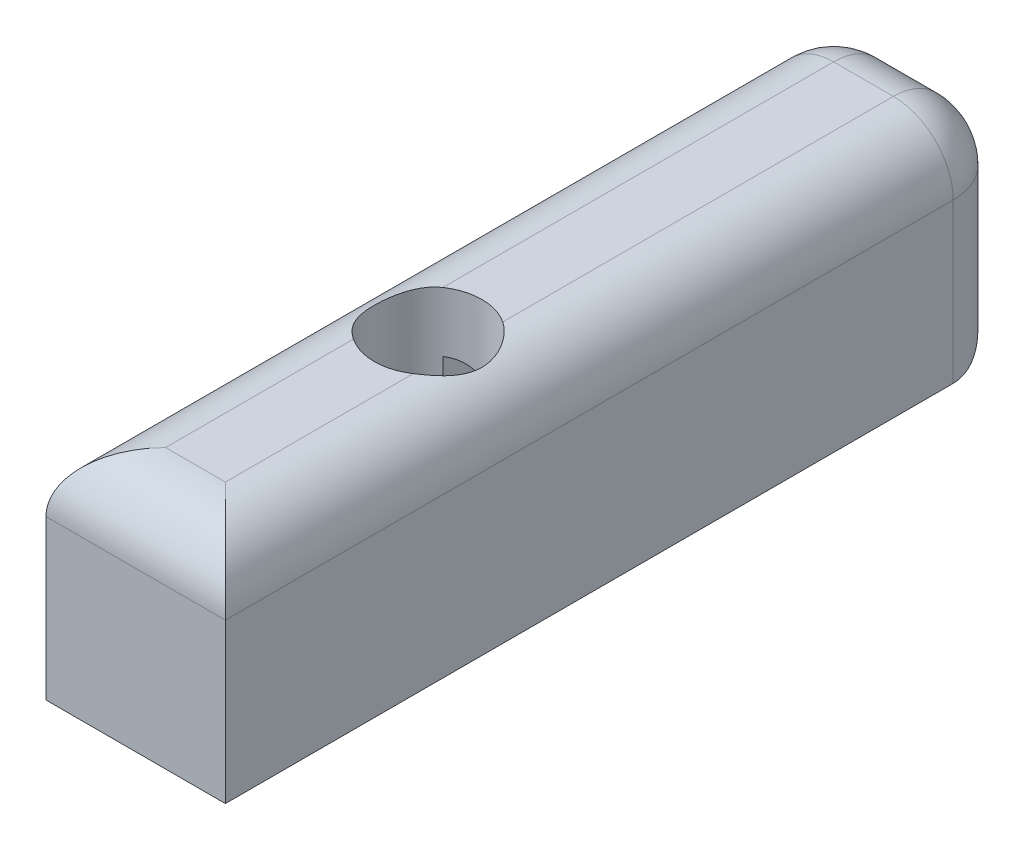
ISO-10303-21;
HEADER;
FILE_DESCRIPTION(('STEP AP214'),'2;1');
FILE_NAME('part.step','',(''),(''),'','','');
FILE_SCHEMA(('AUTOMOTIVE_DESIGN { 1 0 10303 214 1 1 1 1 }'));
ENDSEC;
DATA;
#1=APPLICATION_CONTEXT('core data for automotive mechanical design processes');
#2=APPLICATION_PROTOCOL_DEFINITION('international standard','automotive_design',2000,#1);
#3=PRODUCT_CONTEXT('',#1,'mechanical');
#4=PRODUCT('Part','Part','',(#3));
#5=PRODUCT_RELATED_PRODUCT_CATEGORY('part','',(#4));
#6=PRODUCT_DEFINITION_FORMATION('','',#4);
#7=PRODUCT_DEFINITION_CONTEXT('part definition',#1,'design');
#8=PRODUCT_DEFINITION('design','',#6,#7);
#9=PRODUCT_DEFINITION_SHAPE('','',#8);
#10=(LENGTH_UNIT() NAMED_UNIT(*) SI_UNIT(.MILLI.,.METRE.));
#11=(NAMED_UNIT(*) PLANE_ANGLE_UNIT() SI_UNIT($,.RADIAN.));
#12=(NAMED_UNIT(*) SI_UNIT($,.STERADIAN.) SOLID_ANGLE_UNIT());
#13=UNCERTAINTY_MEASURE_WITH_UNIT(LENGTH_MEASURE(1.E-05),#10,'distance_accuracy_value','');
#14=(GEOMETRIC_REPRESENTATION_CONTEXT(3) GLOBAL_UNCERTAINTY_ASSIGNED_CONTEXT((#13)) GLOBAL_UNIT_ASSIGNED_CONTEXT((#10,
#11,#12)) REPRESENTATION_CONTEXT('',''));
#15=CARTESIAN_POINT('',(0.,0.,0.));
#16=DIRECTION('',(0.,0.,1.));
#17=DIRECTION('',(1.,0.,0.));
#18=AXIS2_PLACEMENT_3D('',#15,#16,#17);
#19=CARTESIAN_POINT('',(30.,25.4386129135543,48.894996249429));
#20=DIRECTION('',(0.,-1.,0.));
#21=DIRECTION('',(0.,0.,-1.));
#22=AXIS2_PLACEMENT_3D('',#19,#20,#21);
#23=PLANE('',#22);
#24=DIRECTION('',(-1.,0.,0.));
#25=VECTOR('',#24,1.);
#26=CARTESIAN_POINT('',(30.,25.4386129135543,38.894996249429));
#27=LINE('',#26,#25);
#28=CARTESIAN_POINT('',(10.,25.4386129135543,38.894996249429));
#29=VERTEX_POINT('',#28);
#30=CARTESIAN_POINT('',(20.,25.4386129135543,38.894996249429));
#31=VERTEX_POINT('',#30);
#32=EDGE_CURVE('E226',#29,#31,#27,.F.);
#33=ORIENTED_EDGE('',*,*,#32,.T.);
#34=DIRECTION('',(0.,0.,1.));
#35=VECTOR('',#34,1.);
#36=CARTESIAN_POINT('',(20.,25.4386129135543,-82.8131468008347));
#37=LINE('',#36,#35);
#38=CARTESIAN_POINT('',(20.,25.4386129135543,7.48331477354788));
#39=VERTEX_POINT('',#38);
#40=EDGE_CURVE('E233',#31,#39,#37,.F.);
#41=ORIENTED_EDGE('',*,*,#40,.T.);
#42=CARTESIAN_POINT('',(15.,25.4386129135543,0.));
#43=DIRECTION('',(0.,1.,0.));
#44=DIRECTION('',(0.,0.,1.));
#45=AXIS2_PLACEMENT_3D('',#42,#43,#44);
#46=CIRCLE('',#45,9.);
#47=CARTESIAN_POINT('',(10.,25.4386129135543,7.48331477354788));
#48=VERTEX_POINT('',#47);
#49=EDGE_CURVE('E299',#48,#39,#46,.T.);
#50=ORIENTED_EDGE('',*,*,#49,.F.);
#51=DIRECTION('',(0.,0.,1.));
#52=VECTOR('',#51,1.);
#53=CARTESIAN_POINT('',(10.,25.4386129135543,48.894996249429));
#54=LINE('',#53,#52);
#55=EDGE_CURVE('E230',#48,#29,#54,.T.);
#56=ORIENTED_EDGE('',*,*,#55,.T.);
#57=EDGE_LOOP('',(#33,#41,#50,#56));
#58=FACE_BOUND('',#57,.T.);
#59=ADVANCED_FACE('F44',(#58),#23,.F.);
#60=CARTESIAN_POINT('',(30.,25.4386129135543,48.894996249429));
#61=DIRECTION('',(0.,0.,-1.));
#62=DIRECTION('',(-1.,0.,0.));
#63=AXIS2_PLACEMENT_3D('',#60,#61,#62);
#64=PLANE('',#63);
#65=DIRECTION('',(0.,-1.,0.));
#66=VECTOR('',#65,1.);
#67=CARTESIAN_POINT('',(30.,25.4386129135543,48.894996249429));
#68=LINE('',#67,#66);
#69=CARTESIAN_POINT('',(30.,15.4386129135543,48.894996249429));
#70=VERTEX_POINT('',#69);
#71=CARTESIAN_POINT('',(30.,-11.1225104080908,48.894996249429));
#72=VERTEX_POINT('',#71);
#73=EDGE_CURVE('E320',#70,#72,#68,.T.);
#74=ORIENTED_EDGE('',*,*,#73,.F.);
#75=DIRECTION('',(-1.,0.,0.));
#76=VECTOR('',#75,1.);
#77=CARTESIAN_POINT('',(30.,15.4386129135543,48.894996249429));
#78=LINE('',#77,#76);
#79=CARTESIAN_POINT('',(0.,15.4386129135543,48.894996249429));
#80=VERTEX_POINT('',#79);
#81=EDGE_CURVE('E419',#70,#80,#78,.T.);
#82=ORIENTED_EDGE('',*,*,#81,.T.);
#83=DIRECTION('',(0.,-1.,0.));
#84=VECTOR('',#83,1.);
#85=CARTESIAN_POINT('',(0.,25.4386129135543,48.894996249429));
#86=LINE('',#85,#84);
#87=CARTESIAN_POINT('',(0.,-11.1225104080908,48.894996249429));
#88=VERTEX_POINT('',#87);
#89=EDGE_CURVE('E316',#80,#88,#86,.T.);
#90=ORIENTED_EDGE('',*,*,#89,.T.);
#91=DIRECTION('',(-1.,0.,0.));
#92=VECTOR('',#91,1.);
#93=CARTESIAN_POINT('',(30.,-11.1225104080908,48.894996249429));
#94=LINE('',#93,#92);
#95=EDGE_CURVE('E215',#72,#88,#94,.T.);
#96=ORIENTED_EDGE('',*,*,#95,.F.);
#97=EDGE_LOOP('',(#74,#82,#90,#96));
#98=FACE_BOUND('',#97,.T.);
#99=ADVANCED_FACE('F375',(#98),#64,.F.);
#100=CARTESIAN_POINT('',(30.,-11.1225104080908,48.894996249429));
#101=DIRECTION('',(0.,1.,0.));
#102=DIRECTION('',(0.,0.,1.));
#103=AXIS2_PLACEMENT_3D('',#100,#101,#102);
#104=PLANE('',#103);
#105=CARTESIAN_POINT('',(15.,-11.1225104080908,0.));
#106=DIRECTION('',(0.,1.,0.));
#107=DIRECTION('',(0.,0.,1.));
#108=AXIS2_PLACEMENT_3D('',#105,#106,#107);
#109=CIRCLE('',#108,9.);
#110=CARTESIAN_POINT('',(15.,-11.1225104080908,9.));
#111=VERTEX_POINT('',#110);
#112=EDGE_CURVE('E310',#111,#111,#109,.T.);
#113=ORIENTED_EDGE('',*,*,#112,.T.);
#114=EDGE_LOOP('',(#113));
#115=FACE_BOUND('',#114,.T.);
#116=DIRECTION('',(0.,0.,-1.));
#117=VECTOR('',#116,1.);
#118=CARTESIAN_POINT('',(0.,-11.1225104080908,48.894996249429));
#119=LINE('',#118,#117);
#120=CARTESIAN_POINT('',(0.,-11.1225104080908,-72.8131468008347));
#121=VERTEX_POINT('',#120);
#122=EDGE_CURVE('E319',#88,#121,#119,.T.);
#123=ORIENTED_EDGE('',*,*,#122,.T.);
#124=DIRECTION('',(-1.,0.,0.));
#125=VECTOR('',#124,1.);
#126=CARTESIAN_POINT('',(30.,-11.1225104080908,-72.8131468008347));
#127=LINE('',#126,#125);
#128=CARTESIAN_POINT('',(30.,-11.1225104080908,-72.8131468008347));
#129=VERTEX_POINT('',#128);
#130=EDGE_CURVE('E427',#121,#129,#127,.F.);
#131=ORIENTED_EDGE('',*,*,#130,.T.);
#132=DIRECTION('',(0.,0.,-1.));
#133=VECTOR('',#132,1.);
#134=CARTESIAN_POINT('',(30.,-11.1225104080908,48.894996249429));
#135=LINE('',#134,#133);
#136=EDGE_CURVE('E317',#72,#129,#135,.T.);
#137=ORIENTED_EDGE('',*,*,#136,.F.);
#138=ORIENTED_EDGE('',*,*,#95,.T.);
#139=EDGE_LOOP('',(#123,#131,#137,#138));
#140=FACE_BOUND('',#139,.T.);
#141=ADVANCED_FACE('F379',(#115,#140),#104,.F.);
#142=CARTESIAN_POINT('',(30.,25.4386129135543,-82.8131468008347));
#143=DIRECTION('',(0.,0.,1.));
#144=DIRECTION('',(1.,0.,0.));
#145=AXIS2_PLACEMENT_3D('',#142,#143,#144);
#146=PLANE('',#145);
#147=DIRECTION('',(0.,1.,0.));
#148=VECTOR('',#147,1.);
#149=CARTESIAN_POINT('',(20.,-11.1225104080908,-82.8131468008347));
#150=LINE('',#149,#148);
#151=CARTESIAN_POINT('',(20.,15.4386129135543,-82.8131468008347));
#152=VERTEX_POINT('',#151);
#153=CARTESIAN_POINT('',(20.,-1.12251040809084,-82.8131468008347));
#154=VERTEX_POINT('',#153);
#155=EDGE_CURVE('E72',#152,#154,#150,.F.);
#156=ORIENTED_EDGE('',*,*,#155,.T.);
#157=DIRECTION('',(-1.,0.,0.));
#158=VECTOR('',#157,1.);
#159=CARTESIAN_POINT('',(30.,-1.12251040809084,-82.8131468008347));
#160=LINE('',#159,#158);
#161=CARTESIAN_POINT('',(10.,-1.12251040809084,-82.8131468008347));
#162=VERTEX_POINT('',#161);
#163=EDGE_CURVE('E435',#154,#162,#160,.T.);
#164=ORIENTED_EDGE('',*,*,#163,.T.);
#165=DIRECTION('',(0.,1.,0.));
#166=VECTOR('',#165,1.);
#167=CARTESIAN_POINT('',(10.,25.4386129135543,-82.8131468008347));
#168=LINE('',#167,#166);
#169=CARTESIAN_POINT('',(10.,15.4386129135543,-82.8131468008347));
#170=VERTEX_POINT('',#169);
#171=EDGE_CURVE('E440',#162,#170,#168,.T.);
#172=ORIENTED_EDGE('',*,*,#171,.T.);
#173=DIRECTION('',(-1.,0.,0.));
#174=VECTOR('',#173,1.);
#175=CARTESIAN_POINT('',(30.,15.4386129135543,-82.8131468008347));
#176=LINE('',#175,#174);
#177=EDGE_CURVE('E406',#170,#152,#176,.F.);
#178=ORIENTED_EDGE('',*,*,#177,.T.);
#179=EDGE_LOOP('',(#156,#164,#172,#178));
#180=FACE_BOUND('',#179,.T.);
#181=ADVANCED_FACE('F384',(#180),#146,.F.);
#182=CARTESIAN_POINT('',(20.,25.4386129135543,-7.48331477354788));
#183=VERTEX_POINT('',#182);
#184=CARTESIAN_POINT('',(10.,25.4386129135543,-7.48331477354788));
#185=VERTEX_POINT('',#184);
#186=EDGE_CURVE('E302',#183,#185,#46,.T.);
#187=ORIENTED_EDGE('',*,*,#186,.F.);
#188=DIRECTION('',(0.,0.,1.));
#189=VECTOR('',#188,1.);
#190=CARTESIAN_POINT('',(20.,25.4386129135543,-82.8131468008347));
#191=LINE('',#190,#189);
#192=CARTESIAN_POINT('',(20.,25.4386129135543,-72.8131468008347));
#193=VERTEX_POINT('',#192);
#194=EDGE_CURVE('E223',#183,#193,#191,.F.);
#195=ORIENTED_EDGE('',*,*,#194,.T.);
#196=DIRECTION('',(-1.,0.,0.));
#197=VECTOR('',#196,1.);
#198=CARTESIAN_POINT('',(30.,25.4386129135543,-72.8131468008347));
#199=LINE('',#198,#197);
#200=CARTESIAN_POINT('',(10.,25.4386129135543,-72.8131468008347));
#201=VERTEX_POINT('',#200);
#202=EDGE_CURVE('E222',#193,#201,#199,.T.);
#203=ORIENTED_EDGE('',*,*,#202,.T.);
#204=DIRECTION('',(0.,0.,1.));
#205=VECTOR('',#204,1.);
#206=CARTESIAN_POINT('',(10.,25.4386129135543,48.894996249429));
#207=LINE('',#206,#205);
#208=EDGE_CURVE('E224',#201,#185,#207,.T.);
#209=ORIENTED_EDGE('',*,*,#208,.T.);
#210=EDGE_LOOP('',(#187,#195,#203,#209));
#211=FACE_BOUND('',#210,.T.);
#212=ADVANCED_FACE('F374',(#211),#23,.F.);
#213=CARTESIAN_POINT('',(30.,0.,0.));
#214=DIRECTION('',(1.,0.,0.));
#215=DIRECTION('',(0.,0.,-1.));
#216=AXIS2_PLACEMENT_3D('',#213,#214,#215);
#217=PLANE('',#216);
#218=DIRECTION('',(0.,1.,0.));
#219=VECTOR('',#218,1.);
#220=CARTESIAN_POINT('',(30.,25.4386129135543,-72.8131468008347));
#221=LINE('',#220,#219);
#222=CARTESIAN_POINT('',(30.,15.4386129135543,-72.8131468008347));
#223=VERTEX_POINT('',#222);
#224=EDGE_CURVE('E216',#129,#223,#221,.T.);
#225=ORIENTED_EDGE('',*,*,#224,.T.);
#226=DIRECTION('',(0.,0.,1.));
#227=VECTOR('',#226,1.);
#228=CARTESIAN_POINT('',(30.,15.4386129135543,48.894996249429));
#229=LINE('',#228,#227);
#230=EDGE_CURVE('E217',#223,#70,#229,.T.);
#231=ORIENTED_EDGE('',*,*,#230,.T.);
#232=ORIENTED_EDGE('',*,*,#73,.T.);
#233=ORIENTED_EDGE('',*,*,#136,.T.);
#234=EDGE_LOOP('',(#225,#231,#232,#233));
#235=FACE_BOUND('',#234,.T.);
#236=ADVANCED_FACE('F259',(#235),#217,.T.);
#237=CARTESIAN_POINT('',(0.,0.,0.));
#238=DIRECTION('',(1.,0.,0.));
#239=DIRECTION('',(0.,0.,-1.));
#240=AXIS2_PLACEMENT_3D('',#237,#238,#239);
#241=PLANE('',#240);
#242=ORIENTED_EDGE('',*,*,#89,.F.);
#243=DIRECTION('',(0.,0.,1.));
#244=VECTOR('',#243,1.);
#245=CARTESIAN_POINT('',(0.,15.4386129135543,0.));
#246=LINE('',#245,#244);
#247=CARTESIAN_POINT('',(0.,15.4386129135543,-72.8131468008347));
#248=VERTEX_POINT('',#247);
#249=EDGE_CURVE('E445',#80,#248,#246,.F.);
#250=ORIENTED_EDGE('',*,*,#249,.T.);
#251=DIRECTION('',(0.,1.,0.));
#252=VECTOR('',#251,1.);
#253=CARTESIAN_POINT('',(0.,0.,-72.8131468008347));
#254=LINE('',#253,#252);
#255=EDGE_CURVE('E421',#248,#121,#254,.F.);
#256=ORIENTED_EDGE('',*,*,#255,.T.);
#257=ORIENTED_EDGE('',*,*,#122,.F.);
#258=EDGE_LOOP('',(#242,#250,#256,#257));
#259=FACE_BOUND('',#258,.T.);
#260=ADVANCED_FACE('F260',(#259),#241,.F.);
#261=CARTESIAN_POINT('',(15.,-11.1225104080908,0.));
#262=DIRECTION('',(0.,1.,0.));
#263=DIRECTION('',(0.,0.,1.));
#264=AXIS2_PLACEMENT_3D('',#261,#262,#263);
#265=CYLINDRICAL_SURFACE('',#264,9.);
#266=ORIENTED_EDGE('',*,*,#112,.F.);
#267=EDGE_LOOP('',(#266));
#268=FACE_BOUND('',#267,.T.);
#269=ORIENTED_EDGE('',*,*,#49,.T.);
#270=CARTESIAN_POINT('',(20.,25.4386129135543,7.48331477354788));
#271=CARTESIAN_POINT('',(20.2044202657926,25.4386318747185,7.34677883935248));
#272=CARTESIAN_POINT('',(20.4031040774354,25.4323465664144,7.20186948554862));
#273=CARTESIAN_POINT('',(20.787440201232,25.4094129293221,6.8967729737463));
#274=CARTESIAN_POINT('',(20.9731050794621,25.3927747508596,6.73660090996209));
#275=CARTESIAN_POINT('',(21.3296693798486,25.3514395217409,6.40271949756168));
#276=CARTESIAN_POINT('',(21.5006148716042,25.3267688640338,6.22905588312508));
#277=CARTESIAN_POINT('',(21.8274955870689,25.2716050225402,5.86893864486899));
#278=CARTESIAN_POINT('',(21.9834271596409,25.2411104278205,5.68248192876342));
#279=CARTESIAN_POINT('',(22.2789667712618,25.176637351475,5.29859815920714));
#280=CARTESIAN_POINT('',(22.4186252437168,25.142670281313,5.10120795737468));
#281=CARTESIAN_POINT('',(22.6815229255829,25.0733375305751,4.6960123251975));
#282=CARTESIAN_POINT('',(22.8047617199581,25.0379718146753,4.4882066317658));
#283=CARTESIAN_POINT('',(23.0343193571445,24.9679009119605,4.06302197622977));
#284=CARTESIAN_POINT('',(23.1406184005511,24.9331965392249,3.8456321853594));
#285=CARTESIAN_POINT('',(23.3354560137158,24.8665148587863,3.40274500600064));
#286=CARTESIAN_POINT('',(23.4240026012248,24.8345363237494,3.1772513320764));
#287=CARTESIAN_POINT('',(23.5872046815364,24.7734929108084,2.70654061415739));
#288=CARTESIAN_POINT('',(23.6608119198475,24.7446894836994,2.4609245261719));
#289=CARTESIAN_POINT('',(23.7869250421873,24.6940883838402,1.96360651152121));
#290=CARTESIAN_POINT('',(23.8394304945266,24.6722908544148,1.71190446046422));
#291=CARTESIAN_POINT('',(23.9227225747835,24.6372158872383,1.20458631067314));
#292=CARTESIAN_POINT('',(23.9535304410565,24.6239301190321,0.9489742903241));
#293=CARTESIAN_POINT('',(23.9931282162408,24.6067862810459,0.435743385142729));
#294=CARTESIAN_POINT('',(24.0019199903198,24.6029274126349,0.178124672169171));
#295=CARTESIAN_POINT('',(23.9975453245965,24.6048346119382,-0.318115708161611));
#296=CARTESIAN_POINT('',(23.9859304483414,24.6099206107542,-0.556755379971042));
#297=CARTESIAN_POINT('',(23.9438136384441,24.6281101748992,-1.03204195848955));
#298=CARTESIAN_POINT('',(23.9133124911049,24.6412134064418,-1.26868894774541));
#299=CARTESIAN_POINT('',(23.8337187446949,24.6746541011792,-1.73844961652762));
#300=CARTESIAN_POINT('',(23.7846150085864,24.6949958975298,-1.97156109228502));
#301=CARTESIAN_POINT('',(23.6682768413854,24.7417127638449,-2.43259218316828));
#302=CARTESIAN_POINT('',(23.6010417686271,24.7680880473288,-2.66051161423864));
#303=CARTESIAN_POINT('',(23.449251872875,24.8252634393159,-3.10901933659943));
#304=CARTESIAN_POINT('',(23.364758635888,24.8560477007177,-3.32963054103472));
#305=CARTESIAN_POINT('',(23.1788747957965,24.9204072513608,-3.7631963198589));
#306=CARTESIAN_POINT('',(23.0774834297285,24.9539826665904,-3.97615054800141));
#307=CARTESIAN_POINT('',(22.8584413835322,25.022059789564,-4.39321623606131));
#308=CARTESIAN_POINT('',(22.7407997132875,25.0565609755374,-4.59733251432194));
#309=CARTESIAN_POINT('',(22.4897858014023,25.1245757292883,-4.99585594840936));
#310=CARTESIAN_POINT('',(22.3564117471173,25.1580891827047,-5.19026198176651));
#311=CARTESIAN_POINT('',(22.0636249812448,25.2246076591115,-5.58298600291862));
#312=CARTESIAN_POINT('',(21.9029956110192,25.2573722638524,-5.7804407815538));
#313=CARTESIAN_POINT('',(21.5651193718358,25.3168629423484,-6.1614970346938));
#314=CARTESIAN_POINT('',(21.3878759016209,25.3435902473543,-6.34510132877934));
#315=CARTESIAN_POINT('',(21.0171302832242,25.3885076635957,-6.69774429747021));
#316=CARTESIAN_POINT('',(20.8235727693653,25.4066672001396,-6.86672907603768));
#317=CARTESIAN_POINT('',(20.5225457740762,25.4254582725653,-7.10760510893026));
#318=CARTESIAN_POINT('',(20.4203540965996,25.4303143149011,-7.18584210792421));
#319=CARTESIAN_POINT('',(20.2126287363944,25.4368923209694,-7.3379203548175));
#320=CARTESIAN_POINT('',(20.1070945081115,25.4386137703796,-7.41176087942351));
#321=CARTESIAN_POINT('',(20.,25.4386129135543,-7.48331477354788));
#322=B_SPLINE_CURVE_WITH_KNOTS('',3,(#270,#271,#272,#273,#274,#275,#276,#277,#278,#279,#280,
#281,#282,#283,#284,#285,#286,#287,#288,#289,#290,#291,#292,#293,#294,#295,#296,#297,#298,#299,
#300,#301,#302,#303,#304,#305,#306,#307,#308,#309,#310,#311,#312,#313,#314,#315,#316,#317,#318,
#319,#320,#321),.UNSPECIFIED.,.F.,.F.,(4,2,2,2,2,2,2,2,2,2,2,2,2,2,2,2,2,2,2,2,2,2,2,2,2,4),(0.,
0.737014834996572,1.47330821028985,2.20720629951156,2.94128241223595,3.67301930705886,
4.40477469429356,5.13737919126581,5.86965206434414,6.64270654416793,7.41577683793051,
8.18808936780906,8.96033646640454,9.6763788931482,10.3923915104861,11.1088334709506,
11.8253007895423,12.53925470358,13.2532408619188,13.9668327320774,14.6805069009033,
15.4494563585372,16.2182488542303,16.98976446903,17.3760078228971,17.76231454565),.UNSPECIFIED.);
#323=EDGE_CURVE('E245',#39,#183,#322,.T.);
#324=ORIENTED_EDGE('',*,*,#323,.T.);
#325=ORIENTED_EDGE('',*,*,#186,.T.);
#326=CARTESIAN_POINT('',(10.,25.4386129135543,-7.48331477354788));
#327=CARTESIAN_POINT('',(9.79557973420741,25.4386318747185,-7.34677883935248));
#328=CARTESIAN_POINT('',(9.59689592256461,25.4323465664144,-7.20186948554863));
#329=CARTESIAN_POINT('',(9.21255979876804,25.4094129293221,-6.8967729737463));
#330=CARTESIAN_POINT('',(9.02689492053788,25.3927747508596,-6.73660090996209));
#331=CARTESIAN_POINT('',(8.67033062015141,25.3514395217409,-6.40271949756168));
#332=CARTESIAN_POINT('',(8.4993851283958,25.3267688640338,-6.22905588312508));
#333=CARTESIAN_POINT('',(8.17250441293108,25.2716050225402,-5.86893864486899));
#334=CARTESIAN_POINT('',(8.01657284035906,25.2411104278205,-5.68248192876342));
#335=CARTESIAN_POINT('',(7.72103322873821,25.176637351475,-5.29859815920713));
#336=CARTESIAN_POINT('',(7.58137475628317,25.142670281313,-5.10120795737468));
#337=CARTESIAN_POINT('',(7.31847707441709,25.0733375305751,-4.69601232519749));
#338=CARTESIAN_POINT('',(7.19523828004191,25.0379718146753,-4.48820663176579));
#339=CARTESIAN_POINT('',(6.96568064285553,24.9679009119605,-4.06302197622977));
#340=CARTESIAN_POINT('',(6.85938159944887,24.9331965392249,-3.8456321853594));
#341=CARTESIAN_POINT('',(6.66454398628421,24.8665148587863,-3.40274500600063));
#342=CARTESIAN_POINT('',(6.57599739877523,24.8345363237493,-3.1772513320764));
#343=CARTESIAN_POINT('',(6.41279531846358,24.7734929108084,-2.70654061415739));
#344=CARTESIAN_POINT('',(6.33918808015246,24.7446894836994,-2.4609245261719));
#345=CARTESIAN_POINT('',(6.21307495781272,24.6940883838402,-1.9636065115212));
#346=CARTESIAN_POINT('',(6.16056950547339,24.6722908544148,-1.71190446046421));
#347=CARTESIAN_POINT('',(6.07727742521655,24.6372158872383,-1.20458631067314));
#348=CARTESIAN_POINT('',(6.04646955894347,24.6239301190321,-0.948974290324098));
#349=CARTESIAN_POINT('',(6.00687178375918,24.6067862810459,-0.435743385142727));
#350=CARTESIAN_POINT('',(5.99808000968022,24.6029274126349,-0.178124672169169));
#351=CARTESIAN_POINT('',(6.0024546754035,24.6048346119382,0.318115708161613));
#352=CARTESIAN_POINT('',(6.01406955165858,24.6099206107542,0.556755379971045));
#353=CARTESIAN_POINT('',(6.05618636155593,24.6281101748992,1.03204195848955));
#354=CARTESIAN_POINT('',(6.08668750889512,24.6412134064418,1.26868894774541));
#355=CARTESIAN_POINT('',(6.16628125530507,24.6746541011792,1.73844961652762));
#356=CARTESIAN_POINT('',(6.21538499141361,24.6949958975298,1.97156109228502));
#357=CARTESIAN_POINT('',(6.33172315861456,24.7417127638449,2.43259218316829));
#358=CARTESIAN_POINT('',(6.3989582313729,24.7680880473288,2.66051161423865));
#359=CARTESIAN_POINT('',(6.55074812712497,24.8252634393159,3.10901933659943));
#360=CARTESIAN_POINT('',(6.63524136411199,24.8560477007177,3.32963054103472));
#361=CARTESIAN_POINT('',(6.82112520420353,24.9204072513608,3.7631963198589));
#362=CARTESIAN_POINT('',(6.92251657027147,24.9539826665904,3.97615054800141));
#363=CARTESIAN_POINT('',(7.14155861646785,25.022059789564,4.39321623606131));
#364=CARTESIAN_POINT('',(7.25920028671254,25.0565609755374,4.59733251432194));
#365=CARTESIAN_POINT('',(7.51021419859766,25.1245757292883,4.99585594840936));
#366=CARTESIAN_POINT('',(7.64358825288271,25.1580891827047,5.19026198176651));
#367=CARTESIAN_POINT('',(7.93637501875517,25.2246076591115,5.58298600291863));
#368=CARTESIAN_POINT('',(8.09700438898083,25.2573722638524,5.78044078155381));
#369=CARTESIAN_POINT('',(8.43488062816418,25.3168629423484,6.1614970346938));
#370=CARTESIAN_POINT('',(8.61212409837911,25.3435902473543,6.34510132877934));
#371=CARTESIAN_POINT('',(8.9828697167758,25.3885076635957,6.69774429747022));
#372=CARTESIAN_POINT('',(9.17642723063473,25.4066672001396,6.86672907603768));
#373=CARTESIAN_POINT('',(9.47745422592384,25.4254582725653,7.10760510893026));
#374=CARTESIAN_POINT('',(9.5796459034004,25.4303143149011,7.18584210792421));
#375=CARTESIAN_POINT('',(9.78737126360561,25.4368923209694,7.33792035481751));
#376=CARTESIAN_POINT('',(9.89290549188852,25.4386137703796,7.41176087942351));
#377=CARTESIAN_POINT('',(10.,25.4386129135543,7.48331477354788));
#378=B_SPLINE_CURVE_WITH_KNOTS('',3,(#326,#327,#328,#329,#330,#331,#332,#333,#334,#335,#336,
#337,#338,#339,#340,#341,#342,#343,#344,#345,#346,#347,#348,#349,#350,#351,#352,#353,#354,#355,
#356,#357,#358,#359,#360,#361,#362,#363,#364,#365,#366,#367,#368,#369,#370,#371,#372,#373,#374,
#375,#376,#377),.UNSPECIFIED.,.F.,.F.,(4,2,2,2,2,2,2,2,2,2,2,2,2,2,2,2,2,2,2,2,2,2,2,2,2,4),(0.,
0.73701483499657,1.47330821028985,2.20720629951156,2.94128241223595,3.67301930705887,
4.40477469429357,5.13737919126581,5.86965206434414,6.64270654416794,7.41577683793051,
8.18808936780906,8.96033646640454,9.67637889314821,10.3923915104861,11.1088334709506,
11.8253007895423,12.53925470358,13.2532408619188,13.9668327320774,14.6805069009033,
15.4494563585372,16.2182488542303,16.98976446903,17.3760078228972,17.76231454565),.UNSPECIFIED.);
#379=EDGE_CURVE('E232',#185,#48,#378,.T.);
#380=ORIENTED_EDGE('',*,*,#379,.T.);
#381=EDGE_LOOP('',(#269,#324,#325,#380));
#382=FACE_BOUND('',#381,.T.);
#383=CARTESIAN_POINT('',(15.,15.4386129135543,0.));
#384=DIRECTION('',(0.,-1.,0.));
#385=DIRECTION('',(0.,0.,-1.));
#386=AXIS2_PLACEMENT_3D('',#383,#384,#385);
#387=CIRCLE('',#386,9.);
#388=CARTESIAN_POINT('',(20.,15.4386129135543,7.48331477354788));
#389=VERTEX_POINT('',#388);
#390=CARTESIAN_POINT('',(10.,15.4386129135543,7.48331477354788));
#391=VERTEX_POINT('',#390);
#392=EDGE_CURVE('E182',#389,#391,#387,.T.);
#393=ORIENTED_EDGE('',*,*,#392,.T.);
#394=DIRECTION('',(0.,1.,0.));
#395=VECTOR('',#394,1.);
#396=CARTESIAN_POINT('',(10.,-11.1225104080908,7.48331477354788));
#397=LINE('',#396,#395);
#398=CARTESIAN_POINT('',(10.,-1.12251040809084,7.48331477354788));
#399=VERTEX_POINT('',#398);
#400=EDGE_CURVE('E171',#391,#399,#397,.F.);
#401=ORIENTED_EDGE('',*,*,#400,.T.);
#402=CARTESIAN_POINT('',(15.,-1.12251040809084,0.));
#403=DIRECTION('',(0.,1.,0.));
#404=DIRECTION('',(0.,0.,1.));
#405=AXIS2_PLACEMENT_3D('',#402,#403,#404);
#406=CIRCLE('',#405,9.);
#407=CARTESIAN_POINT('',(20.,-1.12251040809084,7.48331477354788));
#408=VERTEX_POINT('',#407);
#409=EDGE_CURVE('E176',#399,#408,#406,.T.);
#410=ORIENTED_EDGE('',*,*,#409,.T.);
#411=DIRECTION('',(0.,1.,0.));
#412=VECTOR('',#411,1.);
#413=CARTESIAN_POINT('',(20.,-11.1225104080908,7.48331477354788));
#414=LINE('',#413,#412);
#415=EDGE_CURVE('E194',#389,#408,#414,.F.);
#416=ORIENTED_EDGE('',*,*,#415,.F.);
#417=EDGE_LOOP('',(#393,#401,#410,#416));
#418=FACE_BOUND('',#417,.T.);
#419=CARTESIAN_POINT('',(20.,-1.12251040809084,-7.48331477354788));
#420=VERTEX_POINT('',#419);
#421=CARTESIAN_POINT('',(10.,-1.12251040809084,-7.48331477354788));
#422=VERTEX_POINT('',#421);
#423=EDGE_CURVE('E197',#420,#422,#406,.T.);
#424=ORIENTED_EDGE('',*,*,#423,.T.);
#425=DIRECTION('',(0.,1.,0.));
#426=VECTOR('',#425,1.);
#427=CARTESIAN_POINT('',(10.,-11.1225104080908,-7.48331477354788));
#428=LINE('',#427,#426);
#429=CARTESIAN_POINT('',(10.,15.4386129135543,-7.48331477354788));
#430=VERTEX_POINT('',#429);
#431=EDGE_CURVE('E183',#422,#430,#428,.T.);
#432=ORIENTED_EDGE('',*,*,#431,.T.);
#433=CARTESIAN_POINT('',(10.,15.4386129135543,-7.48331477354788));
#434=CARTESIAN_POINT('',(10.1668680470809,15.4386383633604,-7.59485075621062));
#435=CARTESIAN_POINT('',(10.3375410762611,15.4344367779717,-7.70077039929592));
#436=CARTESIAN_POINT('',(10.6852644097764,15.416618647847,-7.90083139449961));
#437=CARTESIAN_POINT('',(10.8623171770635,15.4029984292417,-7.994968133604));
#438=CARTESIAN_POINT('',(11.2211561261529,15.3654098412012,-8.17069315925819));
#439=CARTESIAN_POINT('',(11.4029345289224,15.3414575773045,-8.25230070888685));
#440=CARTESIAN_POINT('',(11.7699224574661,15.2824889536875,-8.40273211239879));
#441=CARTESIAN_POINT('',(11.9551313757416,15.2474745356232,-8.47155820635042));
#442=CARTESIAN_POINT('',(12.3279025408485,15.1657596034757,-8.59643227704676));
#443=CARTESIAN_POINT('',(12.5154700729136,15.1190253305774,-8.65244243065406));
#444=CARTESIAN_POINT('',(12.8907053485434,15.0136741939621,-8.7514874629668));
#445=CARTESIAN_POINT('',(13.0783730978165,14.9550565600708,-8.79452150022521));
#446=CARTESIAN_POINT('',(13.4519480157953,14.8260023749588,-8.86790552549233));
#447=CARTESIAN_POINT('',(13.6378563878848,14.7555746285094,-8.89826490440615));
#448=CARTESIAN_POINT('',(14.006450073745,14.6031170149429,-8.94692234465192));
#449=CARTESIAN_POINT('',(14.1891354447435,14.5210873540642,-8.9652206203521));
#450=CARTESIAN_POINT('',(14.5460775308276,14.3476940357725,-8.99028905739637));
#451=CARTESIAN_POINT('',(14.72043062285,14.2565615626322,-8.99729239311702));
#452=CARTESIAN_POINT('',(15.063588970716,14.0640859643661,-9.00141179557688));
#453=CARTESIAN_POINT('',(15.2323922846573,13.9627393146184,-8.998524437903));
#454=CARTESIAN_POINT('',(15.5634824803911,13.7504328198058,-8.98387204762085));
#455=CARTESIAN_POINT('',(15.7257676950667,13.6394705380034,-8.9721047588542));
#456=CARTESIAN_POINT('',(16.0430804700545,13.4085379812982,-8.94077262522342));
#457=CARTESIAN_POINT('',(16.19810524655,13.28856429639,-8.9212048163766));
#458=CARTESIAN_POINT('',(16.5199500905402,13.0240661738682,-8.87240558613725));
#459=CARTESIAN_POINT('',(16.6856748984407,12.8783797350867,-8.84224719429667));
#460=CARTESIAN_POINT('',(17.0064468001751,12.5771108518926,-8.77502380246427));
#461=CARTESIAN_POINT('',(17.1614901699685,12.4215249920892,-8.73795641020053));
#462=CARTESIAN_POINT('',(17.4605206201734,12.10109567964,-8.65850921729478));
#463=CARTESIAN_POINT('',(17.6044986097824,11.9362448037587,-8.61612512236934));
#464=CARTESIAN_POINT('',(17.8808772711211,11.5981186869678,-8.52769742249977));
#465=CARTESIAN_POINT('',(18.0132770727902,11.4248428144687,-8.48165354303101));
#466=CARTESIAN_POINT('',(18.4466455990242,10.8175486468412,-8.32031819091426));
#467=CARTESIAN_POINT('',(18.7190316740053,10.3637626327612,-8.1998286474861));
#468=CARTESIAN_POINT('',(19.0716819032246,9.65458034688954,-8.0273645678781));
#469=CARTESIAN_POINT('',(19.1798873345538,9.41350938146639,-7.97126990933042));
#470=CARTESIAN_POINT('',(19.3772662241488,8.92240613040055,-7.86461096254106));
#471=CARTESIAN_POINT('',(19.4664410978448,8.67237451283837,-7.81404626313569));
#472=CARTESIAN_POINT('',(19.6199257088389,8.18070978772938,-7.72422809271917));
#473=CARTESIAN_POINT('',(19.6854542773509,7.93955065194208,-7.68446043947691));
#474=CARTESIAN_POINT('',(19.7984700893969,7.45173003544059,-7.6144015640284));
#475=CARTESIAN_POINT('',(19.8459620196776,7.20507000177346,-7.58410788041153));
#476=CARTESIAN_POINT('',(19.92254774337,6.70629875946228,-7.53462941393502));
#477=CARTESIAN_POINT('',(19.951535550036,6.45416455254783,-7.51550867862948));
#478=CARTESIAN_POINT('',(19.980583847084,6.0743169678702,-7.49625918714707));
#479=CARTESIAN_POINT('',(19.9878610706457,5.94734583122619,-7.49141455126429));
#480=CARTESIAN_POINT('',(19.9975699765875,5.69312691306023,-7.4849390372779));
#481=CARTESIAN_POINT('',(20.0000012779879,5.56587911057442,-7.48330841185552));
#482=CARTESIAN_POINT('',(20.,5.43861291355425,-7.48331477354802));
#483=B_SPLINE_CURVE_WITH_KNOTS('',3,(#433,#434,#435,#436,#437,#438,#439,#440,#441,#442,#443,
#444,#445,#446,#447,#448,#449,#450,#451,#452,#453,#454,#455,#456,#457,#458,#459,#460,#461,#462,
#463,#464,#465,#466,#467,#468,#469,#470,#471,#472,#473,#474,#475,#476,#477,#478,#479,#480,#481,
#482),.UNSPECIFIED.,.F.,.F.,(4,2,2,2,2,2,2,2,2,2,2,2,2,2,2,2,2,2,2,2,2,2,2,2,4),(0.,
0.602041772283591,1.20431851192125,1.80565979922502,2.40689559623748,3.00988354373373,
3.61291058407958,4.21549003340929,4.81805877249341,5.40802096740262,5.99818744307912,
6.5885039151366,7.17904490531436,7.84653671863445,8.51426008474765,9.18252628399672,
9.85084265805032,11.4713146115389,12.281083371166,13.0907918818494,13.8491155626238,
14.6072420610477,15.3696728414167,15.7513717749002,16.1331007158493),.UNSPECIFIED.);
#484=CARTESIAN_POINT('',(20.,5.43861291355427,-7.48331477354788));
#485=VERTEX_POINT('',#484);
#486=EDGE_CURVE('E11',#430,#485,#483,.T.);
#487=ORIENTED_EDGE('',*,*,#486,.T.);
#488=DIRECTION('',(0.,1.,0.));
#489=VECTOR('',#488,1.);
#490=CARTESIAN_POINT('',(20.,-11.1225104080908,-7.48331477354788));
#491=LINE('',#490,#489);
#492=EDGE_CURVE('E314',#420,#485,#491,.T.);
#493=ORIENTED_EDGE('',*,*,#492,.F.);
#494=EDGE_LOOP('',(#424,#432,#487,#493));
#495=FACE_BOUND('',#494,.T.);
#496=ADVANCED_FACE('F178',(#268,#382,#418,#495),#265,.F.);
#497=CARTESIAN_POINT('',(30.,-1.12251040809084,48.894996249429));
#498=DIRECTION('',(0.,1.,0.));
#499=DIRECTION('',(0.,0.,1.));
#500=AXIS2_PLACEMENT_3D('',#497,#498,#499);
#501=PLANE('',#500);
#502=ORIENTED_EDGE('',*,*,#423,.F.);
#503=DIRECTION('',(0.,0.,-1.));
#504=VECTOR('',#503,1.);
#505=CARTESIAN_POINT('',(20.,-1.12251040809084,48.894996249429));
#506=LINE('',#505,#504);
#507=CARTESIAN_POINT('',(20.,-1.12251040809084,-72.8131468008347));
#508=VERTEX_POINT('',#507);
#509=EDGE_CURVE('E335',#420,#508,#506,.T.);
#510=ORIENTED_EDGE('',*,*,#509,.T.);
#511=DIRECTION('',(-1.,0.,0.));
#512=VECTOR('',#511,1.);
#513=CARTESIAN_POINT('',(30.,-1.12251040809084,-72.8131468008347));
#514=LINE('',#513,#512);
#515=CARTESIAN_POINT('',(10.,-1.12251040809084,-72.8131468008347));
#516=VERTEX_POINT('',#515);
#517=EDGE_CURVE('E338',#508,#516,#514,.T.);
#518=ORIENTED_EDGE('',*,*,#517,.T.);
#519=DIRECTION('',(0.,0.,-1.));
#520=VECTOR('',#519,1.);
#521=CARTESIAN_POINT('',(10.,-1.12251040809084,48.894996249429));
#522=LINE('',#521,#520);
#523=EDGE_CURVE('E201',#422,#516,#522,.T.);
#524=ORIENTED_EDGE('',*,*,#523,.F.);
#525=EDGE_LOOP('',(#502,#510,#518,#524));
#526=FACE_BOUND('',#525,.T.);
#527=ADVANCED_FACE('F258',(#526),#501,.T.);
#528=CARTESIAN_POINT('',(20.,0.,0.));
#529=DIRECTION('',(1.,0.,0.));
#530=DIRECTION('',(0.,0.,-1.));
#531=AXIS2_PLACEMENT_3D('',#528,#529,#530);
#532=PLANE('',#531);
#533=ORIENTED_EDGE('',*,*,#492,.T.);
#534=DIRECTION('',(0.,0.,1.));
#535=VECTOR('',#534,1.);
#536=CARTESIAN_POINT('',(20.,5.43861291355427,0.));
#537=LINE('',#536,#535);
#538=CARTESIAN_POINT('',(20.,5.43861291355427,-72.8131468008347));
#539=VERTEX_POINT('',#538);
#540=EDGE_CURVE('E64',#485,#539,#537,.F.);
#541=ORIENTED_EDGE('',*,*,#540,.T.);
#542=DIRECTION('',(0.,1.,0.));
#543=VECTOR('',#542,1.);
#544=CARTESIAN_POINT('',(20.,25.4386129135543,-72.8131468008347));
#545=LINE('',#544,#543);
#546=EDGE_CURVE('E328',#508,#539,#545,.T.);
#547=ORIENTED_EDGE('',*,*,#546,.F.);
#548=ORIENTED_EDGE('',*,*,#509,.F.);
#549=EDGE_LOOP('',(#533,#541,#547,#548));
#550=FACE_BOUND('',#549,.T.);
#551=ADVANCED_FACE('F360',(#550),#532,.F.);
#552=CARTESIAN_POINT('',(10.,0.,0.));
#553=DIRECTION('',(1.,0.,0.));
#554=DIRECTION('',(0.,0.,-1.));
#555=AXIS2_PLACEMENT_3D('',#552,#553,#554);
#556=PLANE('',#555);
#557=ORIENTED_EDGE('',*,*,#431,.F.);
#558=ORIENTED_EDGE('',*,*,#523,.T.);
#559=DIRECTION('',(0.,1.,0.));
#560=VECTOR('',#559,1.);
#561=CARTESIAN_POINT('',(10.,25.4386129135543,-72.8131468008347));
#562=LINE('',#561,#560);
#563=CARTESIAN_POINT('',(10.,15.4386129135543,-72.8131468008347));
#564=VERTEX_POINT('',#563);
#565=EDGE_CURVE('E202',#516,#564,#562,.T.);
#566=ORIENTED_EDGE('',*,*,#565,.T.);
#567=DIRECTION('',(0.,0.,1.));
#568=VECTOR('',#567,1.);
#569=CARTESIAN_POINT('',(10.,15.4386129135543,48.894996249429));
#570=LINE('',#569,#568);
#571=EDGE_CURVE('E337',#564,#430,#570,.T.);
#572=ORIENTED_EDGE('',*,*,#571,.T.);
#573=EDGE_LOOP('',(#557,#558,#566,#572));
#574=FACE_BOUND('',#573,.T.);
#575=ADVANCED_FACE('F350',(#574),#556,.T.);
#576=CARTESIAN_POINT('',(30.,25.4386129135543,-72.8131468008347));
#577=DIRECTION('',(0.,0.,1.));
#578=DIRECTION('',(1.,0.,0.));
#579=AXIS2_PLACEMENT_3D('',#576,#577,#578);
#580=PLANE('',#579);
#581=ORIENTED_EDGE('',*,*,#546,.T.);
#582=CARTESIAN_POINT('',(10.,5.43861291355427,-72.8131468008347));
#583=DIRECTION('',(0.,0.,1.));
#584=DIRECTION('',(1.,0.,0.));
#585=AXIS2_PLACEMENT_3D('',#582,#583,#584);
#586=CIRCLE('',#585,10.);
#587=EDGE_CURVE('E54',#539,#564,#586,.T.);
#588=ORIENTED_EDGE('',*,*,#587,.T.);
#589=ORIENTED_EDGE('',*,*,#565,.F.);
#590=ORIENTED_EDGE('',*,*,#517,.F.);
#591=EDGE_LOOP('',(#581,#588,#589,#590));
#592=FACE_BOUND('',#591,.T.);
#593=ADVANCED_FACE('F358',(#592),#580,.T.);
#594=CARTESIAN_POINT('',(30.,25.4386129135543,38.894996249429));
#595=DIRECTION('',(0.,0.,-1.));
#596=DIRECTION('',(-1.,0.,0.));
#597=AXIS2_PLACEMENT_3D('',#594,#595,#596);
#598=PLANE('',#597);
#599=DIRECTION('',(0.,-1.,0.));
#600=VECTOR('',#599,1.);
#601=CARTESIAN_POINT('',(10.,25.4386129135543,38.894996249429));
#602=LINE('',#601,#600);
#603=CARTESIAN_POINT('',(10.,15.4386129135543,38.894996249429));
#604=VERTEX_POINT('',#603);
#605=CARTESIAN_POINT('',(10.,-1.12251040809084,38.894996249429));
#606=VERTEX_POINT('',#605);
#607=EDGE_CURVE('E203',#604,#606,#602,.T.);
#608=ORIENTED_EDGE('',*,*,#607,.F.);
#609=DIRECTION('',(-1.,0.,0.));
#610=VECTOR('',#609,1.);
#611=CARTESIAN_POINT('',(30.,15.4386129135543,38.894996249429));
#612=LINE('',#611,#610);
#613=CARTESIAN_POINT('',(20.,15.4386129135543,38.894996249429));
#614=VERTEX_POINT('',#613);
#615=EDGE_CURVE('E210',#614,#604,#612,.T.);
#616=ORIENTED_EDGE('',*,*,#615,.F.);
#617=DIRECTION('',(0.,-1.,0.));
#618=VECTOR('',#617,1.);
#619=CARTESIAN_POINT('',(20.,25.4386129135543,38.894996249429));
#620=LINE('',#619,#618);
#621=CARTESIAN_POINT('',(20.,-1.12251040809084,38.894996249429));
#622=VERTEX_POINT('',#621);
#623=EDGE_CURVE('E334',#614,#622,#620,.T.);
#624=ORIENTED_EDGE('',*,*,#623,.T.);
#625=DIRECTION('',(-1.,0.,0.));
#626=VECTOR('',#625,1.);
#627=CARTESIAN_POINT('',(30.,-1.12251040809084,38.894996249429));
#628=LINE('',#627,#626);
#629=EDGE_CURVE('E205',#622,#606,#628,.T.);
#630=ORIENTED_EDGE('',*,*,#629,.T.);
#631=EDGE_LOOP('',(#608,#616,#624,#630));
#632=FACE_BOUND('',#631,.T.);
#633=ADVANCED_FACE('F472',(#632),#598,.T.);
#634=ORIENTED_EDGE('',*,*,#400,.F.);
#635=EDGE_CURVE('E336',#391,#604,#570,.T.);
#636=ORIENTED_EDGE('',*,*,#635,.T.);
#637=ORIENTED_EDGE('',*,*,#607,.T.);
#638=EDGE_CURVE('E195',#606,#399,#522,.T.);
#639=ORIENTED_EDGE('',*,*,#638,.T.);
#640=EDGE_LOOP('',(#634,#636,#637,#639));
#641=FACE_BOUND('',#640,.T.);
#642=ADVANCED_FACE('F200',(#641),#556,.T.);
#643=DIRECTION('',(0.,0.,1.));
#644=VECTOR('',#643,1.);
#645=CARTESIAN_POINT('',(20.,15.4386129135543,48.894996249429));
#646=LINE('',#645,#644);
#647=EDGE_CURVE('E187',#389,#614,#646,.T.);
#648=ORIENTED_EDGE('',*,*,#647,.F.);
#649=ORIENTED_EDGE('',*,*,#415,.T.);
#650=EDGE_CURVE('E192',#622,#408,#506,.T.);
#651=ORIENTED_EDGE('',*,*,#650,.F.);
#652=ORIENTED_EDGE('',*,*,#623,.F.);
#653=EDGE_LOOP('',(#648,#649,#651,#652));
#654=FACE_BOUND('',#653,.T.);
#655=ADVANCED_FACE('F359',(#654),#532,.F.);
#656=CARTESIAN_POINT('',(30.,15.4386129135543,48.894996249429));
#657=DIRECTION('',(0.,-1.,0.));
#658=DIRECTION('',(0.,0.,-1.));
#659=AXIS2_PLACEMENT_3D('',#656,#657,#658);
#660=PLANE('',#659);
#661=ORIENTED_EDGE('',*,*,#392,.F.);
#662=ORIENTED_EDGE('',*,*,#647,.T.);
#663=ORIENTED_EDGE('',*,*,#615,.T.);
#664=ORIENTED_EDGE('',*,*,#635,.F.);
#665=EDGE_LOOP('',(#661,#662,#663,#664));
#666=FACE_BOUND('',#665,.T.);
#667=ADVANCED_FACE('F369',(#666),#660,.T.);
#668=ORIENTED_EDGE('',*,*,#409,.F.);
#669=ORIENTED_EDGE('',*,*,#638,.F.);
#670=ORIENTED_EDGE('',*,*,#629,.F.);
#671=ORIENTED_EDGE('',*,*,#650,.T.);
#672=EDGE_LOOP('',(#668,#669,#670,#671));
#673=FACE_BOUND('',#672,.T.);
#674=ADVANCED_FACE('F188',(#673),#501,.T.);
#675=CARTESIAN_POINT('',(10.,25.4386129135543,-72.8131468008347));
#676=DIRECTION('',(0.,1.,0.));
#677=DIRECTION('',(0.,0.,1.));
#678=AXIS2_PLACEMENT_3D('',#675,#676,#677);
#679=CYLINDRICAL_SURFACE('',#678,10.);
#680=CARTESIAN_POINT('',(10.,15.4386129135543,-72.8131468008347));
#681=DIRECTION('',(0.,1.,0.));
#682=DIRECTION('',(0.,0.,1.));
#683=AXIS2_PLACEMENT_3D('',#680,#681,#682);
#684=CIRCLE('',#683,10.);
#685=EDGE_CURVE('E295',#170,#248,#684,.T.);
#686=ORIENTED_EDGE('',*,*,#685,.F.);
#687=ORIENTED_EDGE('',*,*,#171,.F.);
#688=CARTESIAN_POINT('',(10.,-1.12251040809084,-72.8131468008347));
#689=DIRECTION('',(-0.707106781186547,0.707106781186547,0.));
#690=DIRECTION('',(0.707106781186547,0.707106781186547,0.));
#691=AXIS2_PLACEMENT_3D('',#688,#689,#690);
#692=ELLIPSE('',#691,14.1421356237309,10.);
#693=EDGE_CURVE('E49',#121,#162,#692,.F.);
#694=ORIENTED_EDGE('',*,*,#693,.F.);
#695=ORIENTED_EDGE('',*,*,#255,.F.);
#696=EDGE_LOOP('',(#686,#687,#694,#695));
#697=FACE_BOUND('',#696,.T.);
#698=ADVANCED_FACE('F450',(#697),#679,.T.);
#699=CARTESIAN_POINT('',(30.,-1.12251040809084,-72.8131468008347));
#700=DIRECTION('',(-1.,0.,0.));
#701=DIRECTION('',(0.,0.,1.));
#702=AXIS2_PLACEMENT_3D('',#699,#700,#701);
#703=CYLINDRICAL_SURFACE('',#702,10.);
#704=ORIENTED_EDGE('',*,*,#693,.T.);
#705=ORIENTED_EDGE('',*,*,#163,.F.);
#706=CARTESIAN_POINT('',(20.,-1.12251040809084,-72.8131468008347));
#707=DIRECTION('',(-0.707106781186547,-0.707106781186547,0.));
#708=DIRECTION('',(0.707106781186547,-0.707106781186547,0.));
#709=AXIS2_PLACEMENT_3D('',#706,#707,#708);
#710=ELLIPSE('',#709,14.1421356237309,10.);
#711=EDGE_CURVE('E290',#129,#154,#710,.F.);
#712=ORIENTED_EDGE('',*,*,#711,.F.);
#713=ORIENTED_EDGE('',*,*,#130,.F.);
#714=EDGE_LOOP('',(#704,#705,#712,#713));
#715=FACE_BOUND('',#714,.T.);
#716=ADVANCED_FACE('F431',(#715),#703,.T.);
#717=CARTESIAN_POINT('',(10.,15.4386129135543,-72.8131468008347));
#718=DIRECTION('',(0.,0.,-1.));
#719=DIRECTION('',(-1.,0.,0.));
#720=AXIS2_PLACEMENT_3D('',#717,#718,#719);
#721=SPHERICAL_SURFACE('',#720,10.);
#722=CARTESIAN_POINT('',(10.,15.4386129135543,-72.8131468008347));
#723=DIRECTION('',(0.,0.,-1.));
#724=DIRECTION('',(-1.,0.,0.));
#725=AXIS2_PLACEMENT_3D('',#722,#723,#724);
#726=CIRCLE('',#725,10.);
#727=EDGE_CURVE('E281',#201,#248,#726,.F.);
#728=ORIENTED_EDGE('',*,*,#727,.F.);
#729=CARTESIAN_POINT('',(10.,15.4386129135543,-72.8131468008347));
#730=DIRECTION('',(-1.,0.,0.));
#731=DIRECTION('',(0.,0.,1.));
#732=AXIS2_PLACEMENT_3D('',#729,#730,#731);
#733=CIRCLE('',#732,10.);
#734=EDGE_CURVE('E289',#170,#201,#733,.F.);
#735=ORIENTED_EDGE('',*,*,#734,.F.);
#736=ORIENTED_EDGE('',*,*,#685,.T.);
#737=EDGE_LOOP('',(#728,#735,#736));
#738=FACE_BOUND('',#737,.T.);
#739=ADVANCED_FACE('F408',(#738),#721,.T.);
#740=CARTESIAN_POINT('',(30.,15.4386129135543,-72.8131468008347));
#741=DIRECTION('',(-1.,0.,0.));
#742=DIRECTION('',(0.,0.,1.));
#743=AXIS2_PLACEMENT_3D('',#740,#741,#742);
#744=CYLINDRICAL_SURFACE('',#743,10.);
#745=ORIENTED_EDGE('',*,*,#734,.T.);
#746=ORIENTED_EDGE('',*,*,#202,.F.);
#747=CARTESIAN_POINT('',(20.,15.4386129135543,-72.8131468008347));
#748=DIRECTION('',(1.,0.,0.));
#749=DIRECTION('',(0.,0.,-1.));
#750=AXIS2_PLACEMENT_3D('',#747,#748,#749);
#751=CIRCLE('',#750,10.);
#752=EDGE_CURVE('E282',#152,#193,#751,.T.);
#753=ORIENTED_EDGE('',*,*,#752,.F.);
#754=ORIENTED_EDGE('',*,*,#177,.F.);
#755=EDGE_LOOP('',(#745,#746,#753,#754));
#756=FACE_BOUND('',#755,.T.);
#757=ADVANCED_FACE('F409',(#756),#744,.T.);
#758=CARTESIAN_POINT('',(20.,0.,-72.8131468008347));
#759=DIRECTION('',(0.,-1.,0.));
#760=DIRECTION('',(0.,0.,-1.));
#761=AXIS2_PLACEMENT_3D('',#758,#759,#760);
#762=CYLINDRICAL_SURFACE('',#761,10.);
#763=ORIENTED_EDGE('',*,*,#711,.T.);
#764=ORIENTED_EDGE('',*,*,#155,.F.);
#765=CARTESIAN_POINT('',(20.,15.4386129135543,-72.8131468008347));
#766=DIRECTION('',(0.,1.,0.));
#767=DIRECTION('',(0.,0.,1.));
#768=AXIS2_PLACEMENT_3D('',#765,#766,#767);
#769=CIRCLE('',#768,10.);
#770=EDGE_CURVE('E279',#223,#152,#769,.T.);
#771=ORIENTED_EDGE('',*,*,#770,.F.);
#772=ORIENTED_EDGE('',*,*,#224,.F.);
#773=EDGE_LOOP('',(#763,#764,#771,#772));
#774=FACE_BOUND('',#773,.T.);
#775=ADVANCED_FACE('F432',(#774),#762,.T.);
#776=CARTESIAN_POINT('',(10.,15.4386129135543,48.894996249429));
#777=DIRECTION('',(0.,0.,1.));
#778=DIRECTION('',(1.,0.,0.));
#779=AXIS2_PLACEMENT_3D('',#776,#777,#778);
#780=CYLINDRICAL_SURFACE('',#779,10.);
#781=ORIENTED_EDGE('',*,*,#727,.T.);
#782=ORIENTED_EDGE('',*,*,#249,.F.);
#783=CARTESIAN_POINT('',(10.,15.4386129135543,38.894996249429));
#784=DIRECTION('',(0.707106781186547,0.,0.707106781186547));
#785=DIRECTION('',(-0.707106781186547,0.,0.707106781186547));
#786=AXIS2_PLACEMENT_3D('',#783,#784,#785);
#787=ELLIPSE('',#786,14.1421356237309,10.);
#788=EDGE_CURVE('E274',#29,#80,#787,.T.);
#789=ORIENTED_EDGE('',*,*,#788,.F.);
#790=ORIENTED_EDGE('',*,*,#55,.F.);
#791=ORIENTED_EDGE('',*,*,#379,.F.);
#792=ORIENTED_EDGE('',*,*,#208,.F.);
#793=EDGE_LOOP('',(#781,#782,#789,#790,#791,#792));
#794=FACE_BOUND('',#793,.T.);
#795=ADVANCED_FACE('F247',(#794),#780,.T.);
#796=CARTESIAN_POINT('',(20.,15.4386129135543,-72.8131468008347));
#797=DIRECTION('',(0.,0.,-1.));
#798=DIRECTION('',(-1.,0.,0.));
#799=AXIS2_PLACEMENT_3D('',#796,#797,#798);
#800=SPHERICAL_SURFACE('',#799,10.);
#801=ORIENTED_EDGE('',*,*,#770,.T.);
#802=ORIENTED_EDGE('',*,*,#752,.T.);
#803=CARTESIAN_POINT('',(20.,15.4386129135543,-72.8131468008347));
#804=DIRECTION('',(0.,0.,-1.));
#805=DIRECTION('',(-1.,0.,0.));
#806=AXIS2_PLACEMENT_3D('',#803,#804,#805);
#807=CIRCLE('',#806,10.);
#808=EDGE_CURVE('E275',#223,#193,#807,.F.);
#809=ORIENTED_EDGE('',*,*,#808,.F.);
#810=EDGE_LOOP('',(#801,#802,#809));
#811=FACE_BOUND('',#810,.T.);
#812=ADVANCED_FACE('F401',(#811),#800,.T.);
#813=CARTESIAN_POINT('',(30.,15.4386129135543,38.894996249429));
#814=DIRECTION('',(-1.,0.,0.));
#815=DIRECTION('',(0.,0.,1.));
#816=AXIS2_PLACEMENT_3D('',#813,#814,#815);
#817=CYLINDRICAL_SURFACE('',#816,10.);
#818=ORIENTED_EDGE('',*,*,#788,.T.);
#819=ORIENTED_EDGE('',*,*,#81,.F.);
#820=CARTESIAN_POINT('',(20.,15.4386129135543,38.894996249429));
#821=DIRECTION('',(-0.707106781186547,0.,0.707106781186547));
#822=DIRECTION('',(-0.707106781186547,0.,-0.707106781186547));
#823=AXIS2_PLACEMENT_3D('',#820,#821,#822);
#824=ELLIPSE('',#823,14.1421356237309,10.);
#825=EDGE_CURVE('E269',#31,#70,#824,.F.);
#826=ORIENTED_EDGE('',*,*,#825,.F.);
#827=ORIENTED_EDGE('',*,*,#32,.F.);
#828=EDGE_LOOP('',(#818,#819,#826,#827));
#829=FACE_BOUND('',#828,.T.);
#830=ADVANCED_FACE('F420',(#829),#817,.T.);
#831=CARTESIAN_POINT('',(20.,15.4386129135543,0.));
#832=DIRECTION('',(0.,0.,-1.));
#833=DIRECTION('',(-1.,0.,0.));
#834=AXIS2_PLACEMENT_3D('',#831,#832,#833);
#835=CYLINDRICAL_SURFACE('',#834,10.);
#836=ORIENTED_EDGE('',*,*,#323,.F.);
#837=ORIENTED_EDGE('',*,*,#40,.F.);
#838=ORIENTED_EDGE('',*,*,#825,.T.);
#839=ORIENTED_EDGE('',*,*,#230,.F.);
#840=ORIENTED_EDGE('',*,*,#808,.T.);
#841=ORIENTED_EDGE('',*,*,#194,.F.);
#842=EDGE_LOOP('',(#836,#837,#838,#839,#840,#841));
#843=FACE_BOUND('',#842,.T.);
#844=ADVANCED_FACE('F396',(#843),#835,.T.);
#845=CARTESIAN_POINT('',(10.,5.43861291355427,48.894996249429));
#846=DIRECTION('',(0.,0.,1.));
#847=DIRECTION('',(1.,0.,0.));
#848=AXIS2_PLACEMENT_3D('',#845,#846,#847);
#849=CYLINDRICAL_SURFACE('',#848,10.);
#850=ORIENTED_EDGE('',*,*,#587,.F.);
#851=ORIENTED_EDGE('',*,*,#540,.F.);
#852=ORIENTED_EDGE('',*,*,#486,.F.);
#853=ORIENTED_EDGE('',*,*,#571,.F.);
#854=EDGE_LOOP('',(#850,#851,#852,#853));
#855=FACE_BOUND('',#854,.T.);
#856=ADVANCED_FACE('F50',(#855),#849,.F.);
#857=CLOSED_SHELL('',(#59,#99,#141,#181,#212,#236,#260,#496,#527,#551,#575,#593,#633,#642,#655,
#667,#674,#698,#716,#739,#757,#775,#795,#812,#830,#844,#856));
#858=MANIFOLD_SOLID_BREP('B2',#857);
#859=ADVANCED_BREP_SHAPE_REPRESENTATION('',(#18,#858),#14);
#860=SHAPE_DEFINITION_REPRESENTATION(#9,#859);
ENDSEC;
END-ISO-10303-21;
